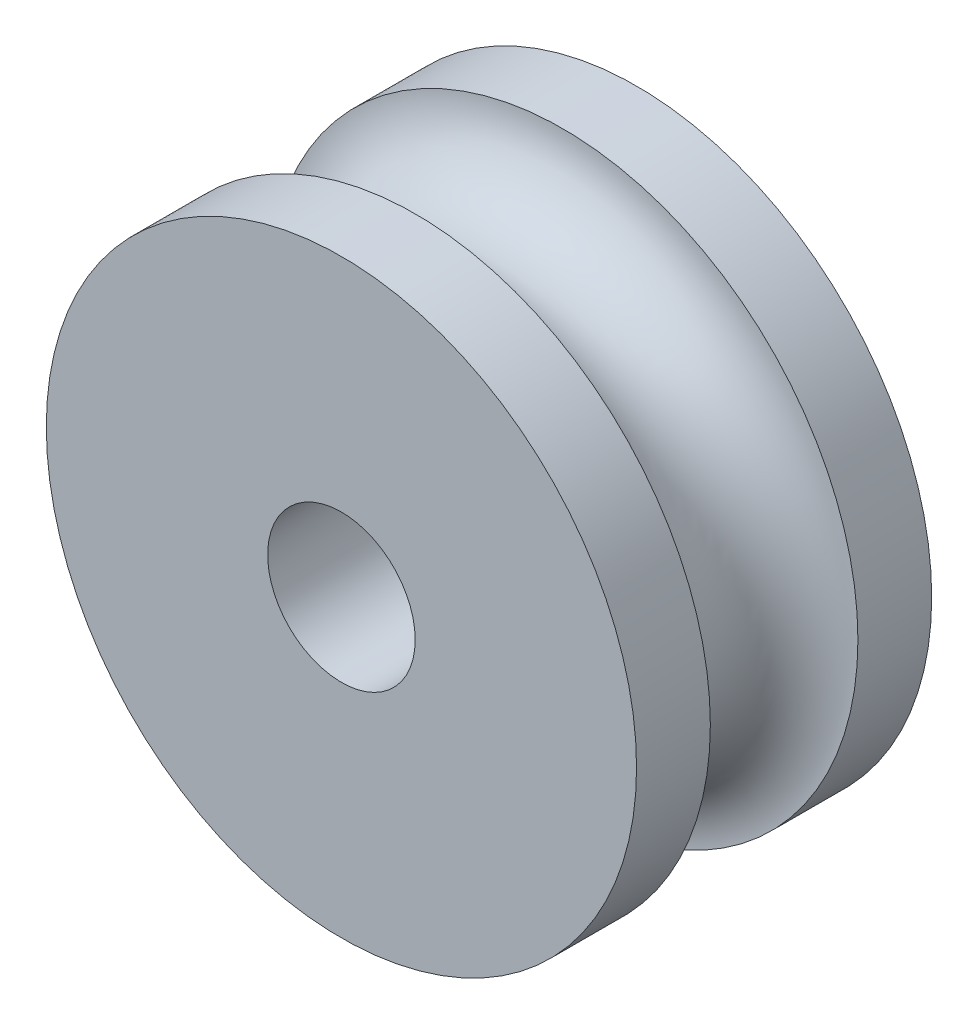
ISO-10303-21;
HEADER;
FILE_DESCRIPTION(('STEP AP214'),'2;1');
FILE_NAME('part.step','',(''),(''),'','','');
FILE_SCHEMA(('AUTOMOTIVE_DESIGN { 1 0 10303 214 1 1 1 1 }'));
ENDSEC;
DATA;
#1=APPLICATION_CONTEXT('core data for automotive mechanical design processes');
#2=APPLICATION_PROTOCOL_DEFINITION('international standard','automotive_design',2000,#1);
#3=PRODUCT_CONTEXT('',#1,'mechanical');
#4=PRODUCT('Part','Part','',(#3));
#5=PRODUCT_RELATED_PRODUCT_CATEGORY('part','',(#4));
#6=PRODUCT_DEFINITION_FORMATION('','',#4);
#7=PRODUCT_DEFINITION_CONTEXT('part definition',#1,'design');
#8=PRODUCT_DEFINITION('design','',#6,#7);
#9=PRODUCT_DEFINITION_SHAPE('','',#8);
#10=(LENGTH_UNIT() NAMED_UNIT(*) SI_UNIT(.MILLI.,.METRE.));
#11=(NAMED_UNIT(*) PLANE_ANGLE_UNIT() SI_UNIT($,.RADIAN.));
#12=(NAMED_UNIT(*) SI_UNIT($,.STERADIAN.) SOLID_ANGLE_UNIT());
#13=UNCERTAINTY_MEASURE_WITH_UNIT(LENGTH_MEASURE(1.E-05),#10,'distance_accuracy_value','');
#14=(GEOMETRIC_REPRESENTATION_CONTEXT(3) GLOBAL_UNCERTAINTY_ASSIGNED_CONTEXT((#13)) GLOBAL_UNIT_ASSIGNED_CONTEXT((#10,
#11,#12)) REPRESENTATION_CONTEXT('',''));
#15=CARTESIAN_POINT('',(0.,0.,0.));
#16=DIRECTION('',(0.,0.,1.));
#17=DIRECTION('',(1.,0.,0.));
#18=AXIS2_PLACEMENT_3D('',#15,#16,#17);
#19=CARTESIAN_POINT('',(0.,0.,40.));
#20=DIRECTION('',(0.,0.,-1.));
#21=DIRECTION('',(-1.,0.,0.));
#22=AXIS2_PLACEMENT_3D('',#19,#20,#21);
#23=CYLINDRICAL_SURFACE('',#22,40.);
#24=CARTESIAN_POINT('',(0.,0.,10.));
#25=DIRECTION('',(0.,0.,1.));
#26=DIRECTION('',(1.,0.,0.));
#27=AXIS2_PLACEMENT_3D('',#24,#25,#26);
#28=CIRCLE('',#27,40.);
#29=CARTESIAN_POINT('',(40.,0.,10.));
#30=VERTEX_POINT('',#29);
#31=EDGE_CURVE('E37',#30,#30,#28,.F.);
#32=ORIENTED_EDGE('',*,*,#31,.T.);
#33=EDGE_LOOP('',(#32));
#34=FACE_BOUND('',#33,.T.);
#35=CARTESIAN_POINT('',(0.,0.,0.));
#36=DIRECTION('',(0.,0.,1.));
#37=DIRECTION('',(1.,0.,0.));
#38=AXIS2_PLACEMENT_3D('',#35,#36,#37);
#39=CIRCLE('',#38,40.);
#40=CARTESIAN_POINT('',(40.,0.,0.));
#41=VERTEX_POINT('',#40);
#42=EDGE_CURVE('E46',#41,#41,#39,.T.);
#43=ORIENTED_EDGE('',*,*,#42,.T.);
#44=EDGE_LOOP('',(#43));
#45=FACE_BOUND('',#44,.T.);
#46=ADVANCED_FACE('F33',(#34,#45),#23,.T.);
#47=CARTESIAN_POINT('',(0.,0.,40.));
#48=DIRECTION('',(0.,0.,-1.));
#49=DIRECTION('',(-1.,0.,0.));
#50=AXIS2_PLACEMENT_3D('',#47,#48,#49);
#51=CYLINDRICAL_SURFACE('',#50,10.);
#52=CARTESIAN_POINT('',(0.,0.,40.));
#53=DIRECTION('',(0.,0.,1.));
#54=DIRECTION('',(1.,0.,0.));
#55=AXIS2_PLACEMENT_3D('',#52,#53,#54);
#56=CIRCLE('',#55,10.);
#57=CARTESIAN_POINT('',(10.,0.,40.));
#58=VERTEX_POINT('',#57);
#59=EDGE_CURVE('E41',#58,#58,#56,.T.);
#60=ORIENTED_EDGE('',*,*,#59,.T.);
#61=EDGE_LOOP('',(#60));
#62=FACE_BOUND('',#61,.T.);
#63=CARTESIAN_POINT('',(0.,0.,0.));
#64=DIRECTION('',(0.,0.,1.));
#65=DIRECTION('',(1.,0.,0.));
#66=AXIS2_PLACEMENT_3D('',#63,#64,#65);
#67=CIRCLE('',#66,10.);
#68=CARTESIAN_POINT('',(10.,0.,0.));
#69=VERTEX_POINT('',#68);
#70=EDGE_CURVE('E49',#69,#69,#67,.T.);
#71=ORIENTED_EDGE('',*,*,#70,.F.);
#72=EDGE_LOOP('',(#71));
#73=FACE_BOUND('',#72,.T.);
#74=ADVANCED_FACE('F35',(#62,#73),#51,.F.);
#75=CARTESIAN_POINT('',(0.,0.,30.));
#76=DIRECTION('',(0.,0.,-1.));
#77=DIRECTION('',(-1.,0.,0.));
#78=AXIS2_PLACEMENT_3D('',#75,#76,#77);
#79=CIRCLE('',#78,40.);
#80=CARTESIAN_POINT('',(-40.,0.,30.));
#81=VERTEX_POINT('',#80);
#82=EDGE_CURVE('E53',#81,#81,#79,.F.);
#83=ORIENTED_EDGE('',*,*,#82,.T.);
#84=EDGE_LOOP('',(#83));
#85=FACE_BOUND('',#84,.T.);
#86=CARTESIAN_POINT('',(0.,0.,40.));
#87=DIRECTION('',(0.,0.,1.));
#88=DIRECTION('',(1.,0.,0.));
#89=AXIS2_PLACEMENT_3D('',#86,#87,#88);
#90=CIRCLE('',#89,40.);
#91=CARTESIAN_POINT('',(40.,0.,40.));
#92=VERTEX_POINT('',#91);
#93=EDGE_CURVE('E10',#92,#92,#90,.T.);
#94=ORIENTED_EDGE('',*,*,#93,.F.);
#95=EDGE_LOOP('',(#94));
#96=FACE_BOUND('',#95,.T.);
#97=ADVANCED_FACE('F75',(#85,#96),#23,.T.);
#98=CARTESIAN_POINT('',(0.,0.,40.));
#99=DIRECTION('',(0.,0.,1.));
#100=DIRECTION('',(1.,0.,0.));
#101=AXIS2_PLACEMENT_3D('',#98,#99,#100);
#102=PLANE('',#101);
#103=ORIENTED_EDGE('',*,*,#59,.F.);
#104=EDGE_LOOP('',(#103));
#105=FACE_BOUND('',#104,.T.);
#106=ORIENTED_EDGE('',*,*,#93,.T.);
#107=EDGE_LOOP('',(#106));
#108=FACE_BOUND('',#107,.T.);
#109=ADVANCED_FACE('F70',(#105,#108),#102,.T.);
#110=CARTESIAN_POINT('',(0.,0.,0.));
#111=DIRECTION('',(0.,0.,1.));
#112=DIRECTION('',(1.,0.,0.));
#113=AXIS2_PLACEMENT_3D('',#110,#111,#112);
#114=PLANE('',#113);
#115=ORIENTED_EDGE('',*,*,#70,.T.);
#116=EDGE_LOOP('',(#115));
#117=FACE_BOUND('',#116,.T.);
#118=ORIENTED_EDGE('',*,*,#42,.F.);
#119=EDGE_LOOP('',(#118));
#120=FACE_BOUND('',#119,.T.);
#121=ADVANCED_FACE('F64',(#117,#120),#114,.F.);
#122=CARTESIAN_POINT('',(0.,0.,20.));
#123=DIRECTION('',(0.,0.,-1.));
#124=DIRECTION('',(-1.,0.,0.));
#125=AXIS2_PLACEMENT_3D('',#122,#123,#124);
#126=TOROIDAL_SURFACE('',#125,40.,10.);
#127=ORIENTED_EDGE('',*,*,#82,.F.);
#128=EDGE_LOOP('',(#127));
#129=FACE_BOUND('',#128,.T.);
#130=ORIENTED_EDGE('',*,*,#31,.F.);
#131=EDGE_LOOP('',(#130));
#132=FACE_BOUND('',#131,.T.);
#133=ADVANCED_FACE('F62',(#129,#132),#126,.F.);
#134=CLOSED_SHELL('',(#46,#74,#97,#109,#121,#133));
#135=MANIFOLD_SOLID_BREP('B2',#134);
#136=ADVANCED_BREP_SHAPE_REPRESENTATION('',(#18,#135),#14);
#137=SHAPE_DEFINITION_REPRESENTATION(#9,#136);
ENDSEC;
END-ISO-10303-21;
